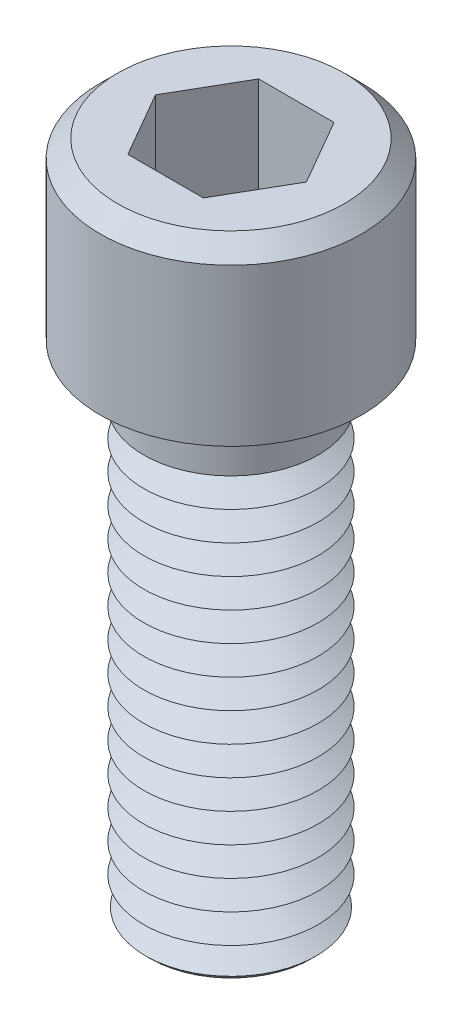
ISO-10303-21;
HEADER;
FILE_DESCRIPTION(('STEP AP214'),'2;1');
FILE_NAME('part.step','',(''),(''),'','','');
FILE_SCHEMA(('AUTOMOTIVE_DESIGN { 1 0 10303 214 1 1 1 1 }'));
ENDSEC;
DATA;
#1=APPLICATION_CONTEXT('core data for automotive mechanical design processes');
#2=APPLICATION_PROTOCOL_DEFINITION('international standard','automotive_design',2000,#1);
#3=PRODUCT_CONTEXT('',#1,'mechanical');
#4=PRODUCT('Part','Part','',(#3));
#5=PRODUCT_RELATED_PRODUCT_CATEGORY('part','',(#4));
#6=PRODUCT_DEFINITION_FORMATION('','',#4);
#7=PRODUCT_DEFINITION_CONTEXT('part definition',#1,'design');
#8=PRODUCT_DEFINITION('design','',#6,#7);
#9=PRODUCT_DEFINITION_SHAPE('','',#8);
#10=(LENGTH_UNIT() NAMED_UNIT(*) SI_UNIT(.MILLI.,.METRE.));
#11=(NAMED_UNIT(*) PLANE_ANGLE_UNIT() SI_UNIT($,.RADIAN.));
#12=(NAMED_UNIT(*) SI_UNIT($,.STERADIAN.) SOLID_ANGLE_UNIT());
#13=UNCERTAINTY_MEASURE_WITH_UNIT(LENGTH_MEASURE(1.E-05),#10,'distance_accuracy_value','');
#14=(GEOMETRIC_REPRESENTATION_CONTEXT(3) GLOBAL_UNCERTAINTY_ASSIGNED_CONTEXT((#13)) GLOBAL_UNIT_ASSIGNED_CONTEXT((#10,
#11,#12)) REPRESENTATION_CONTEXT('',''));
#15=CARTESIAN_POINT('',(0.,0.,0.));
#16=DIRECTION('',(0.,0.,1.));
#17=DIRECTION('',(1.,0.,0.));
#18=AXIS2_PLACEMENT_3D('',#15,#16,#17);
#19=CARTESIAN_POINT('',(0.,-0.889000000000001,0.));
#20=DIRECTION('',(0.,-1.,0.));
#21=DIRECTION('',(0.,0.,-1.));
#22=AXIS2_PLACEMENT_3D('',#19,#20,#21);
#23=CONICAL_SURFACE('',#22,0.776909017995544,1.0471975511966);
#24=CARTESIAN_POINT('',(0.,-1.07103333333333,0.));
#25=DIRECTION('',(0.,-1.,0.));
#26=DIRECTION('',(0.,0.,-1.));
#27=AXIS2_PLACEMENT_3D('',#24,#25,#26);
#28=CIRCLE('',#27,1.0922);
#29=CARTESIAN_POINT('',(0.,-1.07103333333333,-1.0922));
#30=VERTEX_POINT('',#29);
#31=EDGE_CURVE('E146',#30,#30,#28,.T.);
#32=ORIENTED_EDGE('',*,*,#31,.F.);
#33=EDGE_LOOP('',(#32));
#34=FACE_BOUND('',#33,.T.);
#35=CARTESIAN_POINT('',(0.,-0.889000000000001,0.));
#36=DIRECTION('',(0.,-1.,0.));
#37=DIRECTION('',(0.,0.,-1.));
#38=AXIS2_PLACEMENT_3D('',#35,#36,#37);
#39=CIRCLE('',#38,0.776909017995544);
#40=CARTESIAN_POINT('',(0.,-0.889000000000001,-0.776909017995544));
#41=VERTEX_POINT('',#40);
#42=EDGE_CURVE('E236',#41,#41,#39,.T.);
#43=ORIENTED_EDGE('',*,*,#42,.T.);
#44=EDGE_LOOP('',(#43));
#45=FACE_BOUND('',#44,.T.);
#46=ADVANCED_FACE('F30',(#34,#45),#23,.T.);
#47=CARTESIAN_POINT('',(0.,-0.70696666666667,0.));
#48=DIRECTION('',(0.,1.,0.));
#49=DIRECTION('',(0.,0.,1.));
#50=AXIS2_PLACEMENT_3D('',#47,#48,#49);
#51=CONICAL_SURFACE('',#50,1.0922,1.0471975511966);
#52=ORIENTED_EDGE('',*,*,#42,.F.);
#53=EDGE_LOOP('',(#52));
#54=FACE_BOUND('',#53,.T.);
#55=CARTESIAN_POINT('',(0.,-0.70696666666667,0.));
#56=DIRECTION('',(0.,-1.,0.));
#57=DIRECTION('',(0.,0.,-1.));
#58=AXIS2_PLACEMENT_3D('',#55,#56,#57);
#59=CIRCLE('',#58,1.0922);
#60=CARTESIAN_POINT('',(0.,-0.70696666666667,-1.0922));
#61=VERTEX_POINT('',#60);
#62=EDGE_CURVE('E233',#61,#61,#59,.T.);
#63=ORIENTED_EDGE('',*,*,#62,.T.);
#64=EDGE_LOOP('',(#63));
#65=FACE_BOUND('',#64,.T.);
#66=ADVANCED_FACE('F257',(#54,#65),#51,.T.);
#67=CARTESIAN_POINT('',(0.,-5.98593333333335,0.));
#68=DIRECTION('',(0.,-1.,0.));
#69=DIRECTION('',(0.,0.,-1.));
#70=AXIS2_PLACEMENT_3D('',#67,#68,#69);
#71=CONICAL_SURFACE('',#70,0.776909017995544,1.0471975511966);
#72=CARTESIAN_POINT('',(0.,-6.15464090179956,0.));
#73=DIRECTION('',(0.,-1.,0.));
#74=DIRECTION('',(0.,0.,-1.));
#75=AXIS2_PLACEMENT_3D('',#72,#73,#74);
#76=CIRCLE('',#75,1.06911909820044);
#77=CARTESIAN_POINT('',(0.,-6.15464090179956,-1.06911909820044));
#78=VERTEX_POINT('',#77);
#79=EDGE_CURVE('E239',#78,#78,#76,.F.);
#80=ORIENTED_EDGE('',*,*,#79,.T.);
#81=EDGE_LOOP('',(#80));
#82=FACE_BOUND('',#81,.T.);
#83=CARTESIAN_POINT('',(0.,-5.98593333333335,0.));
#84=DIRECTION('',(0.,-1.,0.));
#85=DIRECTION('',(0.,0.,-1.));
#86=AXIS2_PLACEMENT_3D('',#83,#84,#85);
#87=CIRCLE('',#86,0.776909017995544);
#88=CARTESIAN_POINT('',(0.,-5.98593333333335,-0.776909017995544));
#89=VERTEX_POINT('',#88);
#90=EDGE_CURVE('E227',#89,#89,#87,.T.);
#91=ORIENTED_EDGE('',*,*,#90,.T.);
#92=EDGE_LOOP('',(#91));
#93=FACE_BOUND('',#92,.T.);
#94=ADVANCED_FACE('F253',(#82,#93),#71,.T.);
#95=CARTESIAN_POINT('',(0.,-5.80390000000001,0.));
#96=DIRECTION('',(0.,1.,0.));
#97=DIRECTION('',(0.,0.,1.));
#98=AXIS2_PLACEMENT_3D('',#95,#96,#97);
#99=CONICAL_SURFACE('',#98,1.0922,1.0471975511966);
#100=ORIENTED_EDGE('',*,*,#90,.F.);
#101=EDGE_LOOP('',(#100));
#102=FACE_BOUND('',#101,.T.);
#103=CARTESIAN_POINT('',(0.,-5.80390000000001,0.));
#104=DIRECTION('',(0.,-1.,0.));
#105=DIRECTION('',(0.,0.,-1.));
#106=AXIS2_PLACEMENT_3D('',#103,#104,#105);
#107=CIRCLE('',#106,1.0922);
#108=CARTESIAN_POINT('',(0.,-5.80390000000001,-1.0922));
#109=VERTEX_POINT('',#108);
#110=EDGE_CURVE('E224',#109,#109,#107,.T.);
#111=ORIENTED_EDGE('',*,*,#110,.T.);
#112=EDGE_LOOP('',(#111));
#113=FACE_BOUND('',#112,.T.);
#114=ADVANCED_FACE('F256',(#102,#113),#99,.T.);
#115=CARTESIAN_POINT('',(0.,-5.62186666666668,0.));
#116=DIRECTION('',(0.,-1.,0.));
#117=DIRECTION('',(0.,0.,-1.));
#118=AXIS2_PLACEMENT_3D('',#115,#116,#117);
#119=CONICAL_SURFACE('',#118,0.776909017995544,1.04719755119659);
#120=ORIENTED_EDGE('',*,*,#110,.F.);
#121=EDGE_LOOP('',(#120));
#122=FACE_BOUND('',#121,.T.);
#123=CARTESIAN_POINT('',(0.,-5.62186666666668,0.));
#124=DIRECTION('',(0.,-1.,0.));
#125=DIRECTION('',(0.,0.,-1.));
#126=AXIS2_PLACEMENT_3D('',#123,#124,#125);
#127=CIRCLE('',#126,0.776909017995544);
#128=CARTESIAN_POINT('',(0.,-5.62186666666668,-0.776909017995544));
#129=VERTEX_POINT('',#128);
#130=EDGE_CURVE('E221',#129,#129,#127,.T.);
#131=ORIENTED_EDGE('',*,*,#130,.T.);
#132=EDGE_LOOP('',(#131));
#133=FACE_BOUND('',#132,.T.);
#134=ADVANCED_FACE('F263',(#122,#133),#119,.T.);
#135=CARTESIAN_POINT('',(0.,-5.43983333333335,0.));
#136=DIRECTION('',(0.,1.,0.));
#137=DIRECTION('',(0.,0.,1.));
#138=AXIS2_PLACEMENT_3D('',#135,#136,#137);
#139=CONICAL_SURFACE('',#138,1.0922,1.0471975511966);
#140=ORIENTED_EDGE('',*,*,#130,.F.);
#141=EDGE_LOOP('',(#140));
#142=FACE_BOUND('',#141,.T.);
#143=CARTESIAN_POINT('',(0.,-5.43983333333335,0.));
#144=DIRECTION('',(0.,-1.,0.));
#145=DIRECTION('',(0.,0.,-1.));
#146=AXIS2_PLACEMENT_3D('',#143,#144,#145);
#147=CIRCLE('',#146,1.0922);
#148=CARTESIAN_POINT('',(0.,-5.43983333333335,-1.0922));
#149=VERTEX_POINT('',#148);
#150=EDGE_CURVE('E218',#149,#149,#147,.T.);
#151=ORIENTED_EDGE('',*,*,#150,.T.);
#152=EDGE_LOOP('',(#151));
#153=FACE_BOUND('',#152,.T.);
#154=ADVANCED_FACE('F269',(#142,#153),#139,.T.);
#155=CARTESIAN_POINT('',(0.,-5.25780000000001,0.));
#156=DIRECTION('',(0.,-1.,0.));
#157=DIRECTION('',(0.,0.,-1.));
#158=AXIS2_PLACEMENT_3D('',#155,#156,#157);
#159=CONICAL_SURFACE('',#158,0.776909017995544,1.04719755119659);
#160=ORIENTED_EDGE('',*,*,#150,.F.);
#161=EDGE_LOOP('',(#160));
#162=FACE_BOUND('',#161,.T.);
#163=CARTESIAN_POINT('',(0.,-5.25780000000001,0.));
#164=DIRECTION('',(0.,-1.,0.));
#165=DIRECTION('',(0.,0.,-1.));
#166=AXIS2_PLACEMENT_3D('',#163,#164,#165);
#167=CIRCLE('',#166,0.776909017995544);
#168=CARTESIAN_POINT('',(0.,-5.25780000000001,-0.776909017995544));
#169=VERTEX_POINT('',#168);
#170=EDGE_CURVE('E215',#169,#169,#167,.T.);
#171=ORIENTED_EDGE('',*,*,#170,.T.);
#172=EDGE_LOOP('',(#171));
#173=FACE_BOUND('',#172,.T.);
#174=ADVANCED_FACE('F275',(#162,#173),#159,.T.);
#175=CARTESIAN_POINT('',(0.,-5.07576666666668,0.));
#176=DIRECTION('',(0.,1.,0.));
#177=DIRECTION('',(0.,0.,1.));
#178=AXIS2_PLACEMENT_3D('',#175,#176,#177);
#179=CONICAL_SURFACE('',#178,1.0922,1.0471975511966);
#180=ORIENTED_EDGE('',*,*,#170,.F.);
#181=EDGE_LOOP('',(#180));
#182=FACE_BOUND('',#181,.T.);
#183=CARTESIAN_POINT('',(0.,-5.07576666666668,0.));
#184=DIRECTION('',(0.,-1.,0.));
#185=DIRECTION('',(0.,0.,-1.));
#186=AXIS2_PLACEMENT_3D('',#183,#184,#185);
#187=CIRCLE('',#186,1.0922);
#188=CARTESIAN_POINT('',(0.,-5.07576666666668,-1.0922));
#189=VERTEX_POINT('',#188);
#190=EDGE_CURVE('E212',#189,#189,#187,.T.);
#191=ORIENTED_EDGE('',*,*,#190,.T.);
#192=EDGE_LOOP('',(#191));
#193=FACE_BOUND('',#192,.T.);
#194=ADVANCED_FACE('F281',(#182,#193),#179,.T.);
#195=CARTESIAN_POINT('',(0.,-4.89373333333334,0.));
#196=DIRECTION('',(0.,-1.,0.));
#197=DIRECTION('',(0.,0.,-1.));
#198=AXIS2_PLACEMENT_3D('',#195,#196,#197);
#199=CONICAL_SURFACE('',#198,0.776909017995544,1.0471975511966);
#200=ORIENTED_EDGE('',*,*,#190,.F.);
#201=EDGE_LOOP('',(#200));
#202=FACE_BOUND('',#201,.T.);
#203=CARTESIAN_POINT('',(0.,-4.89373333333334,0.));
#204=DIRECTION('',(0.,-1.,0.));
#205=DIRECTION('',(0.,0.,-1.));
#206=AXIS2_PLACEMENT_3D('',#203,#204,#205);
#207=CIRCLE('',#206,0.776909017995544);
#208=CARTESIAN_POINT('',(0.,-4.89373333333334,-0.776909017995544));
#209=VERTEX_POINT('',#208);
#210=EDGE_CURVE('E209',#209,#209,#207,.T.);
#211=ORIENTED_EDGE('',*,*,#210,.T.);
#212=EDGE_LOOP('',(#211));
#213=FACE_BOUND('',#212,.T.);
#214=ADVANCED_FACE('F287',(#202,#213),#199,.T.);
#215=CARTESIAN_POINT('',(0.,-4.71170000000001,0.));
#216=DIRECTION('',(0.,1.,0.));
#217=DIRECTION('',(0.,0.,1.));
#218=AXIS2_PLACEMENT_3D('',#215,#216,#217);
#219=CONICAL_SURFACE('',#218,1.0922,1.04719755119659);
#220=ORIENTED_EDGE('',*,*,#210,.F.);
#221=EDGE_LOOP('',(#220));
#222=FACE_BOUND('',#221,.T.);
#223=CARTESIAN_POINT('',(0.,-4.71170000000001,0.));
#224=DIRECTION('',(0.,-1.,0.));
#225=DIRECTION('',(0.,0.,-1.));
#226=AXIS2_PLACEMENT_3D('',#223,#224,#225);
#227=CIRCLE('',#226,1.0922);
#228=CARTESIAN_POINT('',(0.,-4.71170000000001,-1.0922));
#229=VERTEX_POINT('',#228);
#230=EDGE_CURVE('E206',#229,#229,#227,.T.);
#231=ORIENTED_EDGE('',*,*,#230,.T.);
#232=EDGE_LOOP('',(#231));
#233=FACE_BOUND('',#232,.T.);
#234=ADVANCED_FACE('F293',(#222,#233),#219,.T.);
#235=CARTESIAN_POINT('',(0.,-4.52966666666667,0.));
#236=DIRECTION('',(0.,-1.,0.));
#237=DIRECTION('',(0.,0.,-1.));
#238=AXIS2_PLACEMENT_3D('',#235,#236,#237);
#239=CONICAL_SURFACE('',#238,0.776909017995544,1.0471975511966);
#240=ORIENTED_EDGE('',*,*,#230,.F.);
#241=EDGE_LOOP('',(#240));
#242=FACE_BOUND('',#241,.T.);
#243=CARTESIAN_POINT('',(0.,-4.52966666666667,0.));
#244=DIRECTION('',(0.,-1.,0.));
#245=DIRECTION('',(0.,0.,-1.));
#246=AXIS2_PLACEMENT_3D('',#243,#244,#245);
#247=CIRCLE('',#246,0.776909017995544);
#248=CARTESIAN_POINT('',(0.,-4.52966666666667,-0.776909017995544));
#249=VERTEX_POINT('',#248);
#250=EDGE_CURVE('E203',#249,#249,#247,.T.);
#251=ORIENTED_EDGE('',*,*,#250,.T.);
#252=EDGE_LOOP('',(#251));
#253=FACE_BOUND('',#252,.T.);
#254=ADVANCED_FACE('F299',(#242,#253),#239,.T.);
#255=CARTESIAN_POINT('',(0.,-4.34763333333334,0.));
#256=DIRECTION('',(0.,1.,0.));
#257=DIRECTION('',(0.,0.,1.));
#258=AXIS2_PLACEMENT_3D('',#255,#256,#257);
#259=CONICAL_SURFACE('',#258,1.0922,1.04719755119659);
#260=ORIENTED_EDGE('',*,*,#250,.F.);
#261=EDGE_LOOP('',(#260));
#262=FACE_BOUND('',#261,.T.);
#263=CARTESIAN_POINT('',(0.,-4.34763333333334,0.));
#264=DIRECTION('',(0.,-1.,0.));
#265=DIRECTION('',(0.,0.,-1.));
#266=AXIS2_PLACEMENT_3D('',#263,#264,#265);
#267=CIRCLE('',#266,1.0922);
#268=CARTESIAN_POINT('',(0.,-4.34763333333334,-1.0922));
#269=VERTEX_POINT('',#268);
#270=EDGE_CURVE('E200',#269,#269,#267,.T.);
#271=ORIENTED_EDGE('',*,*,#270,.T.);
#272=EDGE_LOOP('',(#271));
#273=FACE_BOUND('',#272,.T.);
#274=ADVANCED_FACE('F305',(#262,#273),#259,.T.);
#275=CARTESIAN_POINT('',(0.,-4.16560000000001,0.));
#276=DIRECTION('',(0.,-1.,0.));
#277=DIRECTION('',(0.,0.,-1.));
#278=AXIS2_PLACEMENT_3D('',#275,#276,#277);
#279=CONICAL_SURFACE('',#278,0.776909017995544,1.0471975511966);
#280=ORIENTED_EDGE('',*,*,#270,.F.);
#281=EDGE_LOOP('',(#280));
#282=FACE_BOUND('',#281,.T.);
#283=CARTESIAN_POINT('',(0.,-4.16560000000001,0.));
#284=DIRECTION('',(0.,-1.,0.));
#285=DIRECTION('',(0.,0.,-1.));
#286=AXIS2_PLACEMENT_3D('',#283,#284,#285);
#287=CIRCLE('',#286,0.776909017995544);
#288=CARTESIAN_POINT('',(0.,-4.16560000000001,-0.776909017995544));
#289=VERTEX_POINT('',#288);
#290=EDGE_CURVE('E197',#289,#289,#287,.T.);
#291=ORIENTED_EDGE('',*,*,#290,.T.);
#292=EDGE_LOOP('',(#291));
#293=FACE_BOUND('',#292,.T.);
#294=ADVANCED_FACE('F311',(#282,#293),#279,.T.);
#295=CARTESIAN_POINT('',(0.,-3.98356666666667,0.));
#296=DIRECTION('',(0.,1.,0.));
#297=DIRECTION('',(0.,0.,1.));
#298=AXIS2_PLACEMENT_3D('',#295,#296,#297);
#299=CONICAL_SURFACE('',#298,1.0922,1.0471975511966);
#300=ORIENTED_EDGE('',*,*,#290,.F.);
#301=EDGE_LOOP('',(#300));
#302=FACE_BOUND('',#301,.T.);
#303=CARTESIAN_POINT('',(0.,-3.98356666666667,0.));
#304=DIRECTION('',(0.,-1.,0.));
#305=DIRECTION('',(0.,0.,-1.));
#306=AXIS2_PLACEMENT_3D('',#303,#304,#305);
#307=CIRCLE('',#306,1.0922);
#308=CARTESIAN_POINT('',(0.,-3.98356666666667,-1.0922));
#309=VERTEX_POINT('',#308);
#310=EDGE_CURVE('E194',#309,#309,#307,.T.);
#311=ORIENTED_EDGE('',*,*,#310,.T.);
#312=EDGE_LOOP('',(#311));
#313=FACE_BOUND('',#312,.T.);
#314=ADVANCED_FACE('F317',(#302,#313),#299,.T.);
#315=CARTESIAN_POINT('',(0.,-3.80153333333334,0.));
#316=DIRECTION('',(0.,-1.,0.));
#317=DIRECTION('',(0.,0.,-1.));
#318=AXIS2_PLACEMENT_3D('',#315,#316,#317);
#319=CONICAL_SURFACE('',#318,0.776909017995544,1.04719755119659);
#320=ORIENTED_EDGE('',*,*,#310,.F.);
#321=EDGE_LOOP('',(#320));
#322=FACE_BOUND('',#321,.T.);
#323=CARTESIAN_POINT('',(0.,-3.80153333333334,0.));
#324=DIRECTION('',(0.,-1.,0.));
#325=DIRECTION('',(0.,0.,-1.));
#326=AXIS2_PLACEMENT_3D('',#323,#324,#325);
#327=CIRCLE('',#326,0.776909017995544);
#328=CARTESIAN_POINT('',(0.,-3.80153333333334,-0.776909017995544));
#329=VERTEX_POINT('',#328);
#330=EDGE_CURVE('E191',#329,#329,#327,.T.);
#331=ORIENTED_EDGE('',*,*,#330,.T.);
#332=EDGE_LOOP('',(#331));
#333=FACE_BOUND('',#332,.T.);
#334=ADVANCED_FACE('F323',(#322,#333),#319,.T.);
#335=CARTESIAN_POINT('',(0.,-3.6195,0.));
#336=DIRECTION('',(0.,1.,0.));
#337=DIRECTION('',(0.,0.,1.));
#338=AXIS2_PLACEMENT_3D('',#335,#336,#337);
#339=CONICAL_SURFACE('',#338,1.0922,1.0471975511966);
#340=ORIENTED_EDGE('',*,*,#330,.F.);
#341=EDGE_LOOP('',(#340));
#342=FACE_BOUND('',#341,.T.);
#343=CARTESIAN_POINT('',(0.,-3.6195,0.));
#344=DIRECTION('',(0.,-1.,0.));
#345=DIRECTION('',(0.,0.,-1.));
#346=AXIS2_PLACEMENT_3D('',#343,#344,#345);
#347=CIRCLE('',#346,1.0922);
#348=CARTESIAN_POINT('',(0.,-3.6195,-1.0922));
#349=VERTEX_POINT('',#348);
#350=EDGE_CURVE('E188',#349,#349,#347,.T.);
#351=ORIENTED_EDGE('',*,*,#350,.T.);
#352=EDGE_LOOP('',(#351));
#353=FACE_BOUND('',#352,.T.);
#354=ADVANCED_FACE('F329',(#342,#353),#339,.T.);
#355=CARTESIAN_POINT('',(0.,-3.43746666666667,0.));
#356=DIRECTION('',(0.,-1.,0.));
#357=DIRECTION('',(0.,0.,-1.));
#358=AXIS2_PLACEMENT_3D('',#355,#356,#357);
#359=CONICAL_SURFACE('',#358,0.776909017995544,1.0471975511966);
#360=ORIENTED_EDGE('',*,*,#350,.F.);
#361=EDGE_LOOP('',(#360));
#362=FACE_BOUND('',#361,.T.);
#363=CARTESIAN_POINT('',(0.,-3.43746666666667,0.));
#364=DIRECTION('',(0.,-1.,0.));
#365=DIRECTION('',(0.,0.,-1.));
#366=AXIS2_PLACEMENT_3D('',#363,#364,#365);
#367=CIRCLE('',#366,0.776909017995544);
#368=CARTESIAN_POINT('',(0.,-3.43746666666667,-0.776909017995544));
#369=VERTEX_POINT('',#368);
#370=EDGE_CURVE('E185',#369,#369,#367,.T.);
#371=ORIENTED_EDGE('',*,*,#370,.T.);
#372=EDGE_LOOP('',(#371));
#373=FACE_BOUND('',#372,.T.);
#374=ADVANCED_FACE('F335',(#362,#373),#359,.T.);
#375=CARTESIAN_POINT('',(0.,-3.25543333333334,0.));
#376=DIRECTION('',(0.,1.,0.));
#377=DIRECTION('',(0.,0.,1.));
#378=AXIS2_PLACEMENT_3D('',#375,#376,#377);
#379=CONICAL_SURFACE('',#378,1.0922,1.04719755119659);
#380=ORIENTED_EDGE('',*,*,#370,.F.);
#381=EDGE_LOOP('',(#380));
#382=FACE_BOUND('',#381,.T.);
#383=CARTESIAN_POINT('',(0.,-3.25543333333334,0.));
#384=DIRECTION('',(0.,-1.,0.));
#385=DIRECTION('',(0.,0.,-1.));
#386=AXIS2_PLACEMENT_3D('',#383,#384,#385);
#387=CIRCLE('',#386,1.0922);
#388=CARTESIAN_POINT('',(0.,-3.25543333333334,-1.0922));
#389=VERTEX_POINT('',#388);
#390=EDGE_CURVE('E182',#389,#389,#387,.T.);
#391=ORIENTED_EDGE('',*,*,#390,.T.);
#392=EDGE_LOOP('',(#391));
#393=FACE_BOUND('',#392,.T.);
#394=ADVANCED_FACE('F341',(#382,#393),#379,.T.);
#395=CARTESIAN_POINT('',(0.,-3.0734,0.));
#396=DIRECTION('',(0.,-1.,0.));
#397=DIRECTION('',(0.,0.,-1.));
#398=AXIS2_PLACEMENT_3D('',#395,#396,#397);
#399=CONICAL_SURFACE('',#398,0.776909017995544,1.0471975511966);
#400=ORIENTED_EDGE('',*,*,#390,.F.);
#401=EDGE_LOOP('',(#400));
#402=FACE_BOUND('',#401,.T.);
#403=CARTESIAN_POINT('',(0.,-3.0734,0.));
#404=DIRECTION('',(0.,-1.,0.));
#405=DIRECTION('',(0.,0.,-1.));
#406=AXIS2_PLACEMENT_3D('',#403,#404,#405);
#407=CIRCLE('',#406,0.776909017995544);
#408=CARTESIAN_POINT('',(0.,-3.0734,-0.776909017995544));
#409=VERTEX_POINT('',#408);
#410=EDGE_CURVE('E179',#409,#409,#407,.T.);
#411=ORIENTED_EDGE('',*,*,#410,.T.);
#412=EDGE_LOOP('',(#411));
#413=FACE_BOUND('',#412,.T.);
#414=ADVANCED_FACE('F347',(#402,#413),#399,.T.);
#415=CARTESIAN_POINT('',(0.,-2.89136666666667,0.));
#416=DIRECTION('',(0.,1.,0.));
#417=DIRECTION('',(0.,0.,1.));
#418=AXIS2_PLACEMENT_3D('',#415,#416,#417);
#419=CONICAL_SURFACE('',#418,1.0922,1.0471975511966);
#420=ORIENTED_EDGE('',*,*,#410,.F.);
#421=EDGE_LOOP('',(#420));
#422=FACE_BOUND('',#421,.T.);
#423=CARTESIAN_POINT('',(0.,-2.89136666666667,0.));
#424=DIRECTION('',(0.,-1.,0.));
#425=DIRECTION('',(0.,0.,-1.));
#426=AXIS2_PLACEMENT_3D('',#423,#424,#425);
#427=CIRCLE('',#426,1.0922);
#428=CARTESIAN_POINT('',(0.,-2.89136666666667,-1.0922));
#429=VERTEX_POINT('',#428);
#430=EDGE_CURVE('E176',#429,#429,#427,.T.);
#431=ORIENTED_EDGE('',*,*,#430,.T.);
#432=EDGE_LOOP('',(#431));
#433=FACE_BOUND('',#432,.T.);
#434=ADVANCED_FACE('F353',(#422,#433),#419,.T.);
#435=CARTESIAN_POINT('',(0.,-2.70933333333333,0.));
#436=DIRECTION('',(0.,-1.,0.));
#437=DIRECTION('',(0.,0.,-1.));
#438=AXIS2_PLACEMENT_3D('',#435,#436,#437);
#439=CONICAL_SURFACE('',#438,0.776909017995544,1.04719755119659);
#440=ORIENTED_EDGE('',*,*,#430,.F.);
#441=EDGE_LOOP('',(#440));
#442=FACE_BOUND('',#441,.T.);
#443=CARTESIAN_POINT('',(0.,-2.70933333333333,0.));
#444=DIRECTION('',(0.,-1.,0.));
#445=DIRECTION('',(0.,0.,-1.));
#446=AXIS2_PLACEMENT_3D('',#443,#444,#445);
#447=CIRCLE('',#446,0.776909017995544);
#448=CARTESIAN_POINT('',(0.,-2.70933333333333,-0.776909017995544));
#449=VERTEX_POINT('',#448);
#450=EDGE_CURVE('E173',#449,#449,#447,.T.);
#451=ORIENTED_EDGE('',*,*,#450,.T.);
#452=EDGE_LOOP('',(#451));
#453=FACE_BOUND('',#452,.T.);
#454=ADVANCED_FACE('F359',(#442,#453),#439,.T.);
#455=CARTESIAN_POINT('',(0.,-2.5273,0.));
#456=DIRECTION('',(0.,1.,0.));
#457=DIRECTION('',(0.,0.,1.));
#458=AXIS2_PLACEMENT_3D('',#455,#456,#457);
#459=CONICAL_SURFACE('',#458,1.0922,1.0471975511966);
#460=ORIENTED_EDGE('',*,*,#450,.F.);
#461=EDGE_LOOP('',(#460));
#462=FACE_BOUND('',#461,.T.);
#463=CARTESIAN_POINT('',(0.,-2.5273,0.));
#464=DIRECTION('',(0.,-1.,0.));
#465=DIRECTION('',(0.,0.,-1.));
#466=AXIS2_PLACEMENT_3D('',#463,#464,#465);
#467=CIRCLE('',#466,1.0922);
#468=CARTESIAN_POINT('',(0.,-2.5273,-1.0922));
#469=VERTEX_POINT('',#468);
#470=EDGE_CURVE('E170',#469,#469,#467,.T.);
#471=ORIENTED_EDGE('',*,*,#470,.T.);
#472=EDGE_LOOP('',(#471));
#473=FACE_BOUND('',#472,.T.);
#474=ADVANCED_FACE('F365',(#462,#473),#459,.T.);
#475=CARTESIAN_POINT('',(0.,-2.34526666666667,0.));
#476=DIRECTION('',(0.,-1.,0.));
#477=DIRECTION('',(0.,0.,-1.));
#478=AXIS2_PLACEMENT_3D('',#475,#476,#477);
#479=CONICAL_SURFACE('',#478,0.776909017995544,1.0471975511966);
#480=ORIENTED_EDGE('',*,*,#470,.F.);
#481=EDGE_LOOP('',(#480));
#482=FACE_BOUND('',#481,.T.);
#483=CARTESIAN_POINT('',(0.,-2.34526666666667,0.));
#484=DIRECTION('',(0.,-1.,0.));
#485=DIRECTION('',(0.,0.,-1.));
#486=AXIS2_PLACEMENT_3D('',#483,#484,#485);
#487=CIRCLE('',#486,0.776909017995544);
#488=CARTESIAN_POINT('',(0.,-2.34526666666667,-0.776909017995544));
#489=VERTEX_POINT('',#488);
#490=EDGE_CURVE('E167',#489,#489,#487,.T.);
#491=ORIENTED_EDGE('',*,*,#490,.T.);
#492=EDGE_LOOP('',(#491));
#493=FACE_BOUND('',#492,.T.);
#494=ADVANCED_FACE('F371',(#482,#493),#479,.T.);
#495=CARTESIAN_POINT('',(0.,-2.16323333333333,0.));
#496=DIRECTION('',(0.,1.,0.));
#497=DIRECTION('',(0.,0.,1.));
#498=AXIS2_PLACEMENT_3D('',#495,#496,#497);
#499=CONICAL_SURFACE('',#498,1.0922,1.04719755119659);
#500=ORIENTED_EDGE('',*,*,#490,.F.);
#501=EDGE_LOOP('',(#500));
#502=FACE_BOUND('',#501,.T.);
#503=CARTESIAN_POINT('',(0.,-2.16323333333333,0.));
#504=DIRECTION('',(0.,-1.,0.));
#505=DIRECTION('',(0.,0.,-1.));
#506=AXIS2_PLACEMENT_3D('',#503,#504,#505);
#507=CIRCLE('',#506,1.0922);
#508=CARTESIAN_POINT('',(0.,-2.16323333333333,-1.0922));
#509=VERTEX_POINT('',#508);
#510=EDGE_CURVE('E164',#509,#509,#507,.T.);
#511=ORIENTED_EDGE('',*,*,#510,.T.);
#512=EDGE_LOOP('',(#511));
#513=FACE_BOUND('',#512,.T.);
#514=ADVANCED_FACE('F377',(#502,#513),#499,.T.);
#515=CARTESIAN_POINT('',(0.,-1.9812,0.));
#516=DIRECTION('',(0.,-1.,0.));
#517=DIRECTION('',(0.,0.,-1.));
#518=AXIS2_PLACEMENT_3D('',#515,#516,#517);
#519=CONICAL_SURFACE('',#518,0.776909017995544,1.0471975511966);
#520=ORIENTED_EDGE('',*,*,#510,.F.);
#521=EDGE_LOOP('',(#520));
#522=FACE_BOUND('',#521,.T.);
#523=CARTESIAN_POINT('',(0.,-1.9812,0.));
#524=DIRECTION('',(0.,-1.,0.));
#525=DIRECTION('',(0.,0.,-1.));
#526=AXIS2_PLACEMENT_3D('',#523,#524,#525);
#527=CIRCLE('',#526,0.776909017995544);
#528=CARTESIAN_POINT('',(0.,-1.9812,-0.776909017995544));
#529=VERTEX_POINT('',#528);
#530=EDGE_CURVE('E161',#529,#529,#527,.T.);
#531=ORIENTED_EDGE('',*,*,#530,.T.);
#532=EDGE_LOOP('',(#531));
#533=FACE_BOUND('',#532,.T.);
#534=ADVANCED_FACE('F383',(#522,#533),#519,.T.);
#535=CARTESIAN_POINT('',(0.,-1.79916666666667,0.));
#536=DIRECTION('',(0.,1.,0.));
#537=DIRECTION('',(0.,0.,1.));
#538=AXIS2_PLACEMENT_3D('',#535,#536,#537);
#539=CONICAL_SURFACE('',#538,1.0922,1.0471975511966);
#540=ORIENTED_EDGE('',*,*,#530,.F.);
#541=EDGE_LOOP('',(#540));
#542=FACE_BOUND('',#541,.T.);
#543=CARTESIAN_POINT('',(0.,-1.79916666666667,0.));
#544=DIRECTION('',(0.,-1.,0.));
#545=DIRECTION('',(0.,0.,-1.));
#546=AXIS2_PLACEMENT_3D('',#543,#544,#545);
#547=CIRCLE('',#546,1.0922);
#548=CARTESIAN_POINT('',(0.,-1.79916666666667,-1.0922));
#549=VERTEX_POINT('',#548);
#550=EDGE_CURVE('E158',#549,#549,#547,.T.);
#551=ORIENTED_EDGE('',*,*,#550,.T.);
#552=EDGE_LOOP('',(#551));
#553=FACE_BOUND('',#552,.T.);
#554=ADVANCED_FACE('F389',(#542,#553),#539,.T.);
#555=CARTESIAN_POINT('',(0.,-1.61713333333333,0.));
#556=DIRECTION('',(0.,-1.,0.));
#557=DIRECTION('',(0.,0.,-1.));
#558=AXIS2_PLACEMENT_3D('',#555,#556,#557);
#559=CONICAL_SURFACE('',#558,0.776909017995544,1.04719755119659);
#560=ORIENTED_EDGE('',*,*,#550,.F.);
#561=EDGE_LOOP('',(#560));
#562=FACE_BOUND('',#561,.T.);
#563=CARTESIAN_POINT('',(0.,-1.61713333333333,0.));
#564=DIRECTION('',(0.,-1.,0.));
#565=DIRECTION('',(0.,0.,-1.));
#566=AXIS2_PLACEMENT_3D('',#563,#564,#565);
#567=CIRCLE('',#566,0.776909017995544);
#568=CARTESIAN_POINT('',(0.,-1.61713333333333,-0.776909017995544));
#569=VERTEX_POINT('',#568);
#570=EDGE_CURVE('E155',#569,#569,#567,.T.);
#571=ORIENTED_EDGE('',*,*,#570,.T.);
#572=EDGE_LOOP('',(#571));
#573=FACE_BOUND('',#572,.T.);
#574=ADVANCED_FACE('F395',(#562,#573),#559,.T.);
#575=CARTESIAN_POINT('',(0.,-1.4351,0.));
#576=DIRECTION('',(0.,1.,0.));
#577=DIRECTION('',(0.,0.,1.));
#578=AXIS2_PLACEMENT_3D('',#575,#576,#577);
#579=CONICAL_SURFACE('',#578,1.0922,1.0471975511966);
#580=ORIENTED_EDGE('',*,*,#570,.F.);
#581=EDGE_LOOP('',(#580));
#582=FACE_BOUND('',#581,.T.);
#583=CARTESIAN_POINT('',(0.,-1.4351,0.));
#584=DIRECTION('',(0.,-1.,0.));
#585=DIRECTION('',(0.,0.,-1.));
#586=AXIS2_PLACEMENT_3D('',#583,#584,#585);
#587=CIRCLE('',#586,1.0922);
#588=CARTESIAN_POINT('',(0.,-1.4351,-1.0922));
#589=VERTEX_POINT('',#588);
#590=EDGE_CURVE('E152',#589,#589,#587,.T.);
#591=ORIENTED_EDGE('',*,*,#590,.T.);
#592=EDGE_LOOP('',(#591));
#593=FACE_BOUND('',#592,.T.);
#594=ADVANCED_FACE('F401',(#582,#593),#579,.T.);
#595=CARTESIAN_POINT('',(0.,-1.25306666666667,0.));
#596=DIRECTION('',(0.,-1.,0.));
#597=DIRECTION('',(0.,0.,-1.));
#598=AXIS2_PLACEMENT_3D('',#595,#596,#597);
#599=CONICAL_SURFACE('',#598,0.776909017995544,1.0471975511966);
#600=ORIENTED_EDGE('',*,*,#590,.F.);
#601=EDGE_LOOP('',(#600));
#602=FACE_BOUND('',#601,.T.);
#603=CARTESIAN_POINT('',(0.,-1.25306666666667,0.));
#604=DIRECTION('',(0.,-1.,0.));
#605=DIRECTION('',(0.,0.,-1.));
#606=AXIS2_PLACEMENT_3D('',#603,#604,#605);
#607=CIRCLE('',#606,0.776909017995544);
#608=CARTESIAN_POINT('',(0.,-1.25306666666667,-0.776909017995544));
#609=VERTEX_POINT('',#608);
#610=EDGE_CURVE('E149',#609,#609,#607,.T.);
#611=ORIENTED_EDGE('',*,*,#610,.T.);
#612=EDGE_LOOP('',(#611));
#613=FACE_BOUND('',#612,.T.);
#614=ADVANCED_FACE('F407',(#602,#613),#599,.T.);
#615=CARTESIAN_POINT('',(0.,-1.07103333333333,0.));
#616=DIRECTION('',(0.,1.,0.));
#617=DIRECTION('',(0.,0.,1.));
#618=AXIS2_PLACEMENT_3D('',#615,#616,#617);
#619=CONICAL_SURFACE('',#618,1.0922,1.04719755119659);
#620=ORIENTED_EDGE('',*,*,#610,.F.);
#621=EDGE_LOOP('',(#620));
#622=FACE_BOUND('',#621,.T.);
#623=ORIENTED_EDGE('',*,*,#31,.T.);
#624=EDGE_LOOP('',(#623));
#625=FACE_BOUND('',#624,.T.);
#626=ADVANCED_FACE('F413',(#622,#625),#619,.T.);
#627=CARTESIAN_POINT('',(0.,-50.,0.));
#628=DIRECTION('',(0.,-1.,0.));
#629=DIRECTION('',(0.,0.,-1.));
#630=AXIS2_PLACEMENT_3D('',#627,#628,#629);
#631=CYLINDRICAL_SURFACE('',#630,1.0922);
#632=CARTESIAN_POINT('',(0.,0.,0.));
#633=DIRECTION('',(0.,-1.,0.));
#634=DIRECTION('',(0.,0.,-1.));
#635=AXIS2_PLACEMENT_3D('',#632,#633,#634);
#636=CIRCLE('',#635,1.0922);
#637=CARTESIAN_POINT('',(0.,0.,-1.0922));
#638=VERTEX_POINT('',#637);
#639=EDGE_CURVE('E11',#638,#638,#636,.F.);
#640=ORIENTED_EDGE('',*,*,#639,.F.);
#641=EDGE_LOOP('',(#640));
#642=FACE_BOUND('',#641,.T.);
#643=ORIENTED_EDGE('',*,*,#62,.F.);
#644=EDGE_LOOP('',(#643));
#645=FACE_BOUND('',#644,.T.);
#646=ADVANCED_FACE('F250',(#642,#645),#631,.T.);
#647=CARTESIAN_POINT('',(0.,-6.35,0.));
#648=DIRECTION('',(0.,1.,0.));
#649=DIRECTION('',(0.,0.,1.));
#650=AXIS2_PLACEMENT_3D('',#647,#648,#649);
#651=CONICAL_SURFACE('',#650,0.87376,0.785398163397446);
#652=CARTESIAN_POINT('',(0.,-6.21769909820047,0.));
#653=DIRECTION('',(0.,1.,0.));
#654=DIRECTION('',(0.,0.,1.));
#655=AXIS2_PLACEMENT_3D('',#652,#653,#654);
#656=CIRCLE('',#655,1.00606090179953);
#657=CARTESIAN_POINT('',(0.,-6.21769909820047,1.00606090179953));
#658=VERTEX_POINT('',#657);
#659=EDGE_CURVE('E38',#658,#658,#656,.F.);
#660=ORIENTED_EDGE('',*,*,#659,.F.);
#661=EDGE_LOOP('',(#660));
#662=FACE_BOUND('',#661,.T.);
#663=ORIENTED_EDGE('',*,*,#79,.F.);
#664=EDGE_LOOP('',(#663));
#665=FACE_BOUND('',#664,.T.);
#666=ADVANCED_FACE('F247',(#662,#665),#651,.T.);
#667=CARTESIAN_POINT('',(0.,-6.16796666666668,0.));
#668=DIRECTION('',(0.,1.,0.));
#669=DIRECTION('',(0.,0.,1.));
#670=AXIS2_PLACEMENT_3D('',#667,#668,#669);
#671=CONICAL_SURFACE('',#670,1.0922,1.04719755119659);
#672=ORIENTED_EDGE('',*,*,#659,.T.);
#673=EDGE_LOOP('',(#672));
#674=FACE_BOUND('',#673,.T.);
#675=CARTESIAN_POINT('',(0.,-6.35000000000002,0.));
#676=DIRECTION('',(0.,-1.,0.));
#677=DIRECTION('',(0.,0.,-1.));
#678=AXIS2_PLACEMENT_3D('',#675,#676,#677);
#679=CIRCLE('',#678,0.776909017995544);
#680=CARTESIAN_POINT('',(0.,-6.35000000000002,-0.776909017995544));
#681=VERTEX_POINT('',#680);
#682=EDGE_CURVE('E230',#681,#681,#679,.T.);
#683=ORIENTED_EDGE('',*,*,#682,.F.);
#684=EDGE_LOOP('',(#683));
#685=FACE_BOUND('',#684,.T.);
#686=ADVANCED_FACE('F244',(#674,#685),#671,.T.);
#687=CARTESIAN_POINT('',(0.,-6.35,0.));
#688=DIRECTION('',(0.,-1.,0.));
#689=DIRECTION('',(0.,0.,-1.));
#690=AXIS2_PLACEMENT_3D('',#687,#688,#689);
#691=PLANE('',#690);
#692=ORIENTED_EDGE('',*,*,#682,.T.);
#693=EDGE_LOOP('',(#692));
#694=FACE_BOUND('',#693,.T.);
#695=ADVANCED_FACE('F32',(#694),#691,.T.);
#696=CARTESIAN_POINT('',(1.41986,2.1844,0.));
#697=DIRECTION('',(0.,1.,0.));
#698=DIRECTION('',(0.,0.,1.));
#699=AXIS2_PLACEMENT_3D('',#696,#697,#698);
#700=PLANE('',#699);
#701=DIRECTION('',(0.5,0.,-0.866025403784439));
#702=VECTOR('',#701,1.);
#703=CARTESIAN_POINT('',(0.472936473006682,2.1844,0.81915));
#704=LINE('',#703,#702);
#705=CARTESIAN_POINT('',(0.472936473006682,2.1844,0.81915));
#706=VERTEX_POINT('',#705);
#707=CARTESIAN_POINT('',(0.945872946013364,2.1844,0.));
#708=VERTEX_POINT('',#707);
#709=EDGE_CURVE('E45',#706,#708,#704,.T.);
#710=ORIENTED_EDGE('',*,*,#709,.F.);
#711=DIRECTION('',(1.,0.,0.));
#712=VECTOR('',#711,1.);
#713=CARTESIAN_POINT('',(-0.472936473006682,2.1844,0.81915));
#714=LINE('',#713,#712);
#715=CARTESIAN_POINT('',(-0.472936473006682,2.1844,0.81915));
#716=VERTEX_POINT('',#715);
#717=EDGE_CURVE('E128',#716,#706,#714,.T.);
#718=ORIENTED_EDGE('',*,*,#717,.F.);
#719=DIRECTION('',(0.5,0.,0.866025403784439));
#720=VECTOR('',#719,1.);
#721=CARTESIAN_POINT('',(-0.945872946013364,2.1844,0.));
#722=LINE('',#721,#720);
#723=CARTESIAN_POINT('',(-0.945872946013364,2.1844,0.));
#724=VERTEX_POINT('',#723);
#725=EDGE_CURVE('E126',#724,#716,#722,.T.);
#726=ORIENTED_EDGE('',*,*,#725,.F.);
#727=DIRECTION('',(-0.5,0.,0.866025403784439));
#728=VECTOR('',#727,1.);
#729=CARTESIAN_POINT('',(-0.472936473006682,2.1844,-0.81915));
#730=LINE('',#729,#728);
#731=CARTESIAN_POINT('',(-0.472936473006682,2.1844,-0.81915));
#732=VERTEX_POINT('',#731);
#733=EDGE_CURVE('E93',#732,#724,#730,.T.);
#734=ORIENTED_EDGE('',*,*,#733,.F.);
#735=DIRECTION('',(-1.,0.,0.));
#736=VECTOR('',#735,1.);
#737=CARTESIAN_POINT('',(0.472936473006682,2.1844,-0.81915));
#738=LINE('',#737,#736);
#739=CARTESIAN_POINT('',(0.472936473006682,2.1844,-0.81915));
#740=VERTEX_POINT('',#739);
#741=EDGE_CURVE('E122',#740,#732,#738,.T.);
#742=ORIENTED_EDGE('',*,*,#741,.F.);
#743=DIRECTION('',(-0.5,0.,-0.866025403784439));
#744=VECTOR('',#743,1.);
#745=CARTESIAN_POINT('',(0.945872946013364,2.1844,0.));
#746=LINE('',#745,#744);
#747=EDGE_CURVE('E119',#708,#740,#746,.T.);
#748=ORIENTED_EDGE('',*,*,#747,.F.);
#749=EDGE_LOOP('',(#710,#718,#726,#734,#742,#748));
#750=FACE_BOUND('',#749,.T.);
#751=CARTESIAN_POINT('',(0.,2.1844,0.));
#752=DIRECTION('',(0.,-1.,0.));
#753=DIRECTION('',(0.,0.,-1.));
#754=AXIS2_PLACEMENT_3D('',#751,#752,#753);
#755=CIRCLE('',#754,1.41986);
#756=CARTESIAN_POINT('',(0.,2.1844,-1.41986));
#757=VERTEX_POINT('',#756);
#758=EDGE_CURVE('E132',#757,#757,#755,.T.);
#759=ORIENTED_EDGE('',*,*,#758,.F.);
#760=EDGE_LOOP('',(#759));
#761=FACE_BOUND('',#760,.T.);
#762=ADVANCED_FACE('F441',(#750,#761),#700,.T.);
#763=CARTESIAN_POINT('',(0.,0.,0.));
#764=DIRECTION('',(0.,-1.,0.));
#765=DIRECTION('',(0.,0.,-1.));
#766=AXIS2_PLACEMENT_3D('',#763,#764,#765);
#767=PLANE('',#766);
#768=ORIENTED_EDGE('',*,*,#639,.T.);
#769=EDGE_LOOP('',(#768));
#770=FACE_BOUND('',#769,.T.);
#771=CARTESIAN_POINT('',(0.,0.,0.));
#772=DIRECTION('',(0.,-1.,0.));
#773=DIRECTION('',(0.,0.,-1.));
#774=AXIS2_PLACEMENT_3D('',#771,#772,#773);
#775=CIRCLE('',#774,1.6383);
#776=CARTESIAN_POINT('',(0.,0.,-1.6383));
#777=VERTEX_POINT('',#776);
#778=EDGE_CURVE('E143',#777,#777,#775,.T.);
#779=ORIENTED_EDGE('',*,*,#778,.T.);
#780=EDGE_LOOP('',(#779));
#781=FACE_BOUND('',#780,.T.);
#782=ADVANCED_FACE('F444',(#770,#781),#767,.T.);
#783=CARTESIAN_POINT('',(0.,-50.,0.));
#784=DIRECTION('',(0.,-1.,0.));
#785=DIRECTION('',(0.,0.,-1.));
#786=AXIS2_PLACEMENT_3D('',#783,#784,#785);
#787=CYLINDRICAL_SURFACE('',#786,1.6383);
#788=CARTESIAN_POINT('',(0.,1.96596,0.));
#789=DIRECTION('',(0.,-1.,0.));
#790=DIRECTION('',(0.,0.,-1.));
#791=AXIS2_PLACEMENT_3D('',#788,#789,#790);
#792=CIRCLE('',#791,1.6383);
#793=CARTESIAN_POINT('',(0.,1.96596,-1.6383));
#794=VERTEX_POINT('',#793);
#795=EDGE_CURVE('E140',#794,#794,#792,.T.);
#796=ORIENTED_EDGE('',*,*,#795,.T.);
#797=EDGE_LOOP('',(#796));
#798=FACE_BOUND('',#797,.T.);
#799=ORIENTED_EDGE('',*,*,#778,.F.);
#800=EDGE_LOOP('',(#799));
#801=FACE_BOUND('',#800,.T.);
#802=ADVANCED_FACE('F448',(#798,#801),#787,.T.);
#803=CARTESIAN_POINT('',(0.,1.96596,0.));
#804=DIRECTION('',(0.,-1.,0.));
#805=DIRECTION('',(0.,0.,-1.));
#806=AXIS2_PLACEMENT_3D('',#803,#804,#805);
#807=CONICAL_SURFACE('',#806,1.6383,0.785398163397452);
#808=ORIENTED_EDGE('',*,*,#758,.T.);
#809=EDGE_LOOP('',(#808));
#810=FACE_BOUND('',#809,.T.);
#811=ORIENTED_EDGE('',*,*,#795,.F.);
#812=EDGE_LOOP('',(#811));
#813=FACE_BOUND('',#812,.T.);
#814=ADVANCED_FACE('F452',(#810,#813),#807,.T.);
#815=CARTESIAN_POINT('',(0.472936473006682,0.65532,0.81915));
#816=DIRECTION('',(0.866025403784439,0.,0.5));
#817=DIRECTION('',(0.5,0.,-0.866025403784439));
#818=AXIS2_PLACEMENT_3D('',#815,#816,#817);
#819=PLANE('',#818);
#820=ORIENTED_EDGE('',*,*,#709,.T.);
#821=DIRECTION('',(0.,1.,0.));
#822=VECTOR('',#821,1.);
#823=CARTESIAN_POINT('',(0.945872946013364,0.65532,0.));
#824=LINE('',#823,#822);
#825=CARTESIAN_POINT('',(0.945872946013364,0.65532,0.));
#826=VERTEX_POINT('',#825);
#827=EDGE_CURVE('E75',#826,#708,#824,.T.);
#828=ORIENTED_EDGE('',*,*,#827,.F.);
#829=DIRECTION('',(0.5,0.,-0.866025403784439));
#830=VECTOR('',#829,1.);
#831=CARTESIAN_POINT('',(0.472936473006682,0.65532,0.81915));
#832=LINE('',#831,#830);
#833=CARTESIAN_POINT('',(0.472936473006682,0.65532,0.81915));
#834=VERTEX_POINT('',#833);
#835=EDGE_CURVE('E130',#834,#826,#832,.T.);
#836=ORIENTED_EDGE('',*,*,#835,.F.);
#837=DIRECTION('',(0.,1.,0.));
#838=VECTOR('',#837,1.);
#839=CARTESIAN_POINT('',(0.472936473006682,0.65532,0.81915));
#840=LINE('',#839,#838);
#841=EDGE_CURVE('E53',#834,#706,#840,.T.);
#842=ORIENTED_EDGE('',*,*,#841,.T.);
#843=EDGE_LOOP('',(#820,#828,#836,#842));
#844=FACE_BOUND('',#843,.T.);
#845=ADVANCED_FACE('F456',(#844),#819,.F.);
#846=CARTESIAN_POINT('',(-0.472936473006682,0.65532,0.81915));
#847=DIRECTION('',(0.,0.,1.));
#848=DIRECTION('',(1.,0.,0.));
#849=AXIS2_PLACEMENT_3D('',#846,#847,#848);
#850=PLANE('',#849);
#851=ORIENTED_EDGE('',*,*,#717,.T.);
#852=ORIENTED_EDGE('',*,*,#841,.F.);
#853=DIRECTION('',(1.,0.,0.));
#854=VECTOR('',#853,1.);
#855=CARTESIAN_POINT('',(-0.472936473006682,0.65532,0.81915));
#856=LINE('',#855,#854);
#857=CARTESIAN_POINT('',(-0.472936473006682,0.65532,0.81915));
#858=VERTEX_POINT('',#857);
#859=EDGE_CURVE('E105',#858,#834,#856,.T.);
#860=ORIENTED_EDGE('',*,*,#859,.F.);
#861=DIRECTION('',(0.,1.,0.));
#862=VECTOR('',#861,1.);
#863=CARTESIAN_POINT('',(-0.472936473006682,0.65532,0.81915));
#864=LINE('',#863,#862);
#865=EDGE_CURVE('E97',#858,#716,#864,.T.);
#866=ORIENTED_EDGE('',*,*,#865,.T.);
#867=EDGE_LOOP('',(#851,#852,#860,#866));
#868=FACE_BOUND('',#867,.T.);
#869=ADVANCED_FACE('F460',(#868),#850,.F.);
#870=CARTESIAN_POINT('',(-0.945872946013364,0.65532,0.));
#871=DIRECTION('',(-0.866025403784439,0.,0.5));
#872=DIRECTION('',(0.5,0.,0.866025403784439));
#873=AXIS2_PLACEMENT_3D('',#870,#871,#872);
#874=PLANE('',#873);
#875=ORIENTED_EDGE('',*,*,#725,.T.);
#876=ORIENTED_EDGE('',*,*,#865,.F.);
#877=DIRECTION('',(0.5,0.,0.866025403784439));
#878=VECTOR('',#877,1.);
#879=CARTESIAN_POINT('',(-0.945872946013364,0.65532,0.));
#880=LINE('',#879,#878);
#881=CARTESIAN_POINT('',(-0.945872946013364,0.65532,0.));
#882=VERTEX_POINT('',#881);
#883=EDGE_CURVE('E101',#882,#858,#880,.T.);
#884=ORIENTED_EDGE('',*,*,#883,.F.);
#885=DIRECTION('',(0.,1.,0.));
#886=VECTOR('',#885,1.);
#887=CARTESIAN_POINT('',(-0.945872946013364,0.65532,0.));
#888=LINE('',#887,#886);
#889=EDGE_CURVE('E86',#882,#724,#888,.T.);
#890=ORIENTED_EDGE('',*,*,#889,.T.);
#891=EDGE_LOOP('',(#875,#876,#884,#890));
#892=FACE_BOUND('',#891,.T.);
#893=ADVANCED_FACE('F102',(#892),#874,.F.);
#894=CARTESIAN_POINT('',(-0.472936473006682,0.65532,-0.81915));
#895=DIRECTION('',(-0.866025403784439,0.,-0.5));
#896=DIRECTION('',(-0.5,0.,0.866025403784439));
#897=AXIS2_PLACEMENT_3D('',#894,#895,#896);
#898=PLANE('',#897);
#899=ORIENTED_EDGE('',*,*,#733,.T.);
#900=ORIENTED_EDGE('',*,*,#889,.F.);
#901=DIRECTION('',(-0.5,0.,0.866025403784439));
#902=VECTOR('',#901,1.);
#903=CARTESIAN_POINT('',(-0.472936473006682,0.65532,-0.81915));
#904=LINE('',#903,#902);
#905=CARTESIAN_POINT('',(-0.472936473006682,0.65532,-0.81915));
#906=VERTEX_POINT('',#905);
#907=EDGE_CURVE('E90',#906,#882,#904,.T.);
#908=ORIENTED_EDGE('',*,*,#907,.F.);
#909=DIRECTION('',(0.,1.,0.));
#910=VECTOR('',#909,1.);
#911=CARTESIAN_POINT('',(-0.472936473006682,0.65532,-0.81915));
#912=LINE('',#911,#910);
#913=EDGE_CURVE('E98',#906,#732,#912,.T.);
#914=ORIENTED_EDGE('',*,*,#913,.T.);
#915=EDGE_LOOP('',(#899,#900,#908,#914));
#916=FACE_BOUND('',#915,.T.);
#917=ADVANCED_FACE('F88',(#916),#898,.F.);
#918=CARTESIAN_POINT('',(0.472936473006682,0.65532,-0.81915));
#919=DIRECTION('',(0.,0.,-1.));
#920=DIRECTION('',(-1.,0.,0.));
#921=AXIS2_PLACEMENT_3D('',#918,#919,#920);
#922=PLANE('',#921);
#923=ORIENTED_EDGE('',*,*,#741,.T.);
#924=ORIENTED_EDGE('',*,*,#913,.F.);
#925=DIRECTION('',(-1.,0.,0.));
#926=VECTOR('',#925,1.);
#927=CARTESIAN_POINT('',(0.472936473006682,0.65532,-0.81915));
#928=LINE('',#927,#926);
#929=CARTESIAN_POINT('',(0.472936473006682,0.65532,-0.81915));
#930=VERTEX_POINT('',#929);
#931=EDGE_CURVE('E111',#930,#906,#928,.T.);
#932=ORIENTED_EDGE('',*,*,#931,.F.);
#933=DIRECTION('',(0.,1.,0.));
#934=VECTOR('',#933,1.);
#935=CARTESIAN_POINT('',(0.472936473006682,0.65532,-0.81915));
#936=LINE('',#935,#934);
#937=EDGE_CURVE('E135',#930,#740,#936,.T.);
#938=ORIENTED_EDGE('',*,*,#937,.T.);
#939=EDGE_LOOP('',(#923,#924,#932,#938));
#940=FACE_BOUND('',#939,.T.);
#941=ADVANCED_FACE('F464',(#940),#922,.F.);
#942=CARTESIAN_POINT('',(0.945872946013364,0.65532,0.));
#943=DIRECTION('',(0.866025403784439,0.,-0.5));
#944=DIRECTION('',(-0.5,0.,-0.866025403784439));
#945=AXIS2_PLACEMENT_3D('',#942,#943,#944);
#946=PLANE('',#945);
#947=ORIENTED_EDGE('',*,*,#747,.T.);
#948=ORIENTED_EDGE('',*,*,#937,.F.);
#949=DIRECTION('',(-0.5,0.,-0.866025403784439));
#950=VECTOR('',#949,1.);
#951=CARTESIAN_POINT('',(0.945872946013364,0.65532,0.));
#952=LINE('',#951,#950);
#953=EDGE_CURVE('E113',#826,#930,#952,.T.);
#954=ORIENTED_EDGE('',*,*,#953,.F.);
#955=ORIENTED_EDGE('',*,*,#827,.T.);
#956=EDGE_LOOP('',(#947,#948,#954,#955));
#957=FACE_BOUND('',#956,.T.);
#958=ADVANCED_FACE('F461',(#957),#946,.F.);
#959=CARTESIAN_POINT('',(0.472936473006681,0.65532,0.81915));
#960=DIRECTION('',(0.,-1.,0.));
#961=DIRECTION('',(0.,0.,-1.));
#962=AXIS2_PLACEMENT_3D('',#959,#960,#961);
#963=PLANE('',#962);
#964=ORIENTED_EDGE('',*,*,#835,.T.);
#965=ORIENTED_EDGE('',*,*,#953,.T.);
#966=ORIENTED_EDGE('',*,*,#931,.T.);
#967=ORIENTED_EDGE('',*,*,#907,.T.);
#968=ORIENTED_EDGE('',*,*,#883,.T.);
#969=ORIENTED_EDGE('',*,*,#859,.T.);
#970=EDGE_LOOP('',(#964,#965,#966,#967,#968,#969));
#971=FACE_BOUND('',#970,.T.);
#972=ADVANCED_FACE('F108',(#971),#963,.F.);
#973=CLOSED_SHELL('',(#46,#66,#94,#114,#134,#154,#174,#194,#214,#234,#254,#274,#294,#314,#334,
#354,#374,#394,#414,#434,#454,#474,#494,#514,#534,#554,#574,#594,#614,#626,#646,#666,#686,#695,
#762,#782,#802,#814,#845,#869,#893,#917,#941,#958,#972));
#974=MANIFOLD_SOLID_BREP('B2',#973);
#975=ADVANCED_BREP_SHAPE_REPRESENTATION('',(#18,#974),#14);
#976=SHAPE_DEFINITION_REPRESENTATION(#9,#975);
ENDSEC;
END-ISO-10303-21;
